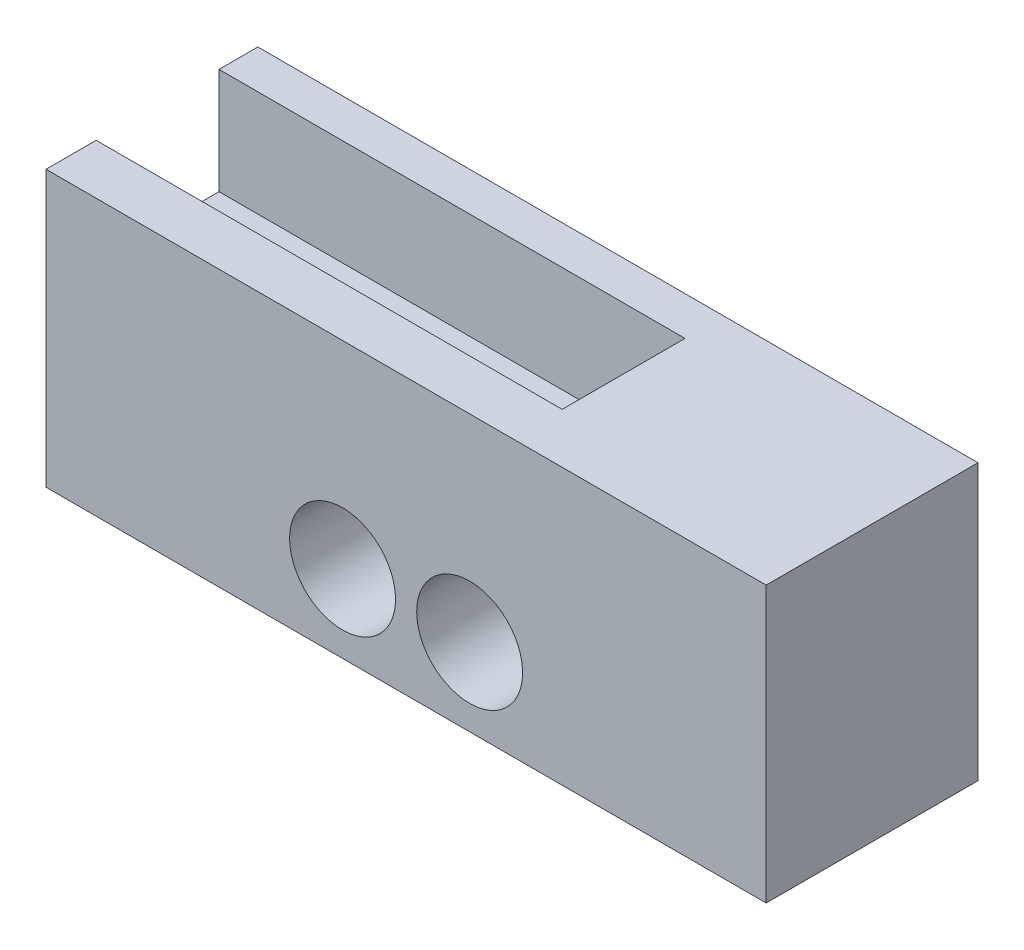
ISO-10303-21;
HEADER;
FILE_DESCRIPTION(('STEP AP214'),'2;1');
FILE_NAME('part.step','',(''),(''),'','','');
FILE_SCHEMA(('AUTOMOTIVE_DESIGN { 1 0 10303 214 1 1 1 1 }'));
ENDSEC;
DATA;
#1=APPLICATION_CONTEXT('core data for automotive mechanical design processes');
#2=APPLICATION_PROTOCOL_DEFINITION('international standard','automotive_design',2000,#1);
#3=PRODUCT_CONTEXT('',#1,'mechanical');
#4=PRODUCT('Part','Part','',(#3));
#5=PRODUCT_RELATED_PRODUCT_CATEGORY('part','',(#4));
#6=PRODUCT_DEFINITION_FORMATION('','',#4);
#7=PRODUCT_DEFINITION_CONTEXT('part definition',#1,'design');
#8=PRODUCT_DEFINITION('design','',#6,#7);
#9=PRODUCT_DEFINITION_SHAPE('','',#8);
#10=(LENGTH_UNIT() NAMED_UNIT(*) SI_UNIT(.MILLI.,.METRE.));
#11=(NAMED_UNIT(*) PLANE_ANGLE_UNIT() SI_UNIT($,.RADIAN.));
#12=(NAMED_UNIT(*) SI_UNIT($,.STERADIAN.) SOLID_ANGLE_UNIT());
#13=UNCERTAINTY_MEASURE_WITH_UNIT(LENGTH_MEASURE(1.E-05),#10,'distance_accuracy_value','');
#14=(GEOMETRIC_REPRESENTATION_CONTEXT(3) GLOBAL_UNCERTAINTY_ASSIGNED_CONTEXT((#13)) GLOBAL_UNIT_ASSIGNED_CONTEXT((#10,
#11,#12)) REPRESENTATION_CONTEXT('',''));
#15=CARTESIAN_POINT('',(0.,0.,0.));
#16=DIRECTION('',(0.,0.,1.));
#17=DIRECTION('',(1.,0.,0.));
#18=AXIS2_PLACEMENT_3D('',#15,#16,#17);
#19=CARTESIAN_POINT('',(-16.2916666666667,13.,-6.1625));
#20=DIRECTION('',(1.,0.,0.));
#21=DIRECTION('',(0.,0.,-1.));
#22=AXIS2_PLACEMENT_3D('',#19,#20,#21);
#23=PLANE('',#22);
#24=DIRECTION('',(0.,1.,0.));
#25=VECTOR('',#24,1.);
#26=CARTESIAN_POINT('',(-16.2916666666667,8.,-4.33087532120165));
#27=LINE('',#26,#25);
#28=CARTESIAN_POINT('',(-16.2916666666667,8.,-4.33087532120165));
#29=VERTEX_POINT('',#28);
#30=CARTESIAN_POINT('',(-16.2916666666667,13.,-4.33087532120165));
#31=VERTEX_POINT('',#30);
#32=EDGE_CURVE('E137',#29,#31,#27,.T.);
#33=ORIENTED_EDGE('',*,*,#32,.T.);
#34=DIRECTION('',(0.,0.,1.));
#35=VECTOR('',#34,1.);
#36=CARTESIAN_POINT('',(-16.2916666666667,13.,-6.1625));
#37=LINE('',#36,#35);
#38=CARTESIAN_POINT('',(-16.2916666666667,13.,-6.1625));
#39=VERTEX_POINT('',#38);
#40=EDGE_CURVE('E171',#39,#31,#37,.T.);
#41=ORIENTED_EDGE('',*,*,#40,.F.);
#42=DIRECTION('',(0.,-1.,0.));
#43=VECTOR('',#42,1.);
#44=CARTESIAN_POINT('',(-16.2916666666667,13.,-6.1625));
#45=LINE('',#44,#43);
#46=CARTESIAN_POINT('',(-16.2916666666667,0.,-6.1625));
#47=VERTEX_POINT('',#46);
#48=EDGE_CURVE('E178',#39,#47,#45,.T.);
#49=ORIENTED_EDGE('',*,*,#48,.T.);
#50=DIRECTION('',(0.,0.,1.));
#51=VECTOR('',#50,1.);
#52=CARTESIAN_POINT('',(-16.2916666666667,0.,-6.1625));
#53=LINE('',#52,#51);
#54=CARTESIAN_POINT('',(-16.2916666666667,0.,3.8375));
#55=VERTEX_POINT('',#54);
#56=EDGE_CURVE('E168',#47,#55,#53,.T.);
#57=ORIENTED_EDGE('',*,*,#56,.T.);
#58=DIRECTION('',(0.,-1.,0.));
#59=VECTOR('',#58,1.);
#60=CARTESIAN_POINT('',(-16.2916666666667,13.,3.8375));
#61=LINE('',#60,#59);
#62=CARTESIAN_POINT('',(-16.2916666666667,13.,3.8375));
#63=VERTEX_POINT('',#62);
#64=EDGE_CURVE('E12',#63,#55,#61,.T.);
#65=ORIENTED_EDGE('',*,*,#64,.F.);
#66=CARTESIAN_POINT('',(-16.2916666666667,13.,1.46912467879835));
#67=VERTEX_POINT('',#66);
#68=EDGE_CURVE('E107',#67,#63,#37,.T.);
#69=ORIENTED_EDGE('',*,*,#68,.F.);
#70=DIRECTION('',(0.,1.,0.));
#71=VECTOR('',#70,1.);
#72=CARTESIAN_POINT('',(-16.2916666666667,8.,1.46912467879835));
#73=LINE('',#72,#71);
#74=CARTESIAN_POINT('',(-16.2916666666667,8.,1.46912467879835));
#75=VERTEX_POINT('',#74);
#76=EDGE_CURVE('E71',#75,#67,#73,.T.);
#77=ORIENTED_EDGE('',*,*,#76,.F.);
#78=DIRECTION('',(0.,0.,1.));
#79=VECTOR('',#78,1.);
#80=CARTESIAN_POINT('',(-16.2916666666667,8.,0.));
#81=LINE('',#80,#79);
#82=EDGE_CURVE('E141',#29,#75,#81,.T.);
#83=ORIENTED_EDGE('',*,*,#82,.F.);
#84=EDGE_LOOP('',(#33,#41,#49,#57,#65,#69,#77,#83));
#85=FACE_BOUND('',#84,.T.);
#86=ADVANCED_FACE('F57',(#85),#23,.F.);
#87=CARTESIAN_POINT('',(0.,13.,0.));
#88=DIRECTION('',(0.,1.,0.));
#89=DIRECTION('',(0.,0.,1.));
#90=AXIS2_PLACEMENT_3D('',#87,#88,#89);
#91=PLANE('',#90);
#92=ORIENTED_EDGE('',*,*,#40,.T.);
#93=DIRECTION('',(1.,0.,0.));
#94=VECTOR('',#93,1.);
#95=CARTESIAN_POINT('',(0.,13.,-4.33087532120165));
#96=LINE('',#95,#94);
#97=CARTESIAN_POINT('',(5.70833333333334,13.,-4.33087532120165));
#98=VERTEX_POINT('',#97);
#99=EDGE_CURVE('E156',#31,#98,#96,.T.);
#100=ORIENTED_EDGE('',*,*,#99,.T.);
#101=DIRECTION('',(0.,0.,1.));
#102=VECTOR('',#101,1.);
#103=CARTESIAN_POINT('',(5.70833333333334,13.,0.));
#104=LINE('',#103,#102);
#105=CARTESIAN_POINT('',(5.70833333333334,13.,1.46912467879835));
#106=VERTEX_POINT('',#105);
#107=EDGE_CURVE('E148',#98,#106,#104,.T.);
#108=ORIENTED_EDGE('',*,*,#107,.T.);
#109=DIRECTION('',(1.,0.,0.));
#110=VECTOR('',#109,1.);
#111=CARTESIAN_POINT('',(0.,13.,1.46912467879835));
#112=LINE('',#111,#110);
#113=EDGE_CURVE('E154',#67,#106,#112,.T.);
#114=ORIENTED_EDGE('',*,*,#113,.F.);
#115=ORIENTED_EDGE('',*,*,#68,.T.);
#116=DIRECTION('',(1.,0.,0.));
#117=VECTOR('',#116,1.);
#118=CARTESIAN_POINT('',(-16.2916666666667,13.,3.8375));
#119=LINE('',#118,#117);
#120=CARTESIAN_POINT('',(17.7083333333333,13.,3.8375));
#121=VERTEX_POINT('',#120);
#122=EDGE_CURVE('E173',#63,#121,#119,.T.);
#123=ORIENTED_EDGE('',*,*,#122,.T.);
#124=DIRECTION('',(0.,0.,-1.));
#125=VECTOR('',#124,1.);
#126=CARTESIAN_POINT('',(17.7083333333333,13.,-6.1625));
#127=LINE('',#126,#125);
#128=CARTESIAN_POINT('',(17.7083333333333,13.,-6.1625));
#129=VERTEX_POINT('',#128);
#130=EDGE_CURVE('E175',#121,#129,#127,.T.);
#131=ORIENTED_EDGE('',*,*,#130,.T.);
#132=DIRECTION('',(-1.,0.,0.));
#133=VECTOR('',#132,1.);
#134=CARTESIAN_POINT('',(-16.2916666666667,13.,-6.1625));
#135=LINE('',#134,#133);
#136=EDGE_CURVE('E80',#129,#39,#135,.T.);
#137=ORIENTED_EDGE('',*,*,#136,.T.);
#138=EDGE_LOOP('',(#92,#100,#108,#114,#115,#123,#131,#137));
#139=FACE_BOUND('',#138,.T.);
#140=ADVANCED_FACE('F216',(#139),#91,.T.);
#141=CARTESIAN_POINT('',(-16.2916666666667,13.,3.8375));
#142=DIRECTION('',(0.,0.,-1.));
#143=DIRECTION('',(-1.,0.,0.));
#144=AXIS2_PLACEMENT_3D('',#141,#142,#143);
#145=PLANE('',#144);
#146=CARTESIAN_POINT('',(-2.29166666666666,3.66319413262773,3.8375));
#147=DIRECTION('',(0.,0.,-1.));
#148=DIRECTION('',(-1.,0.,0.));
#149=AXIS2_PLACEMENT_3D('',#146,#147,#148);
#150=CIRCLE('',#149,2.5);
#151=CARTESIAN_POINT('',(-4.79166666666666,3.66319413262773,3.8375));
#152=VERTEX_POINT('',#151);
#153=EDGE_CURVE('E159',#152,#152,#150,.T.);
#154=ORIENTED_EDGE('',*,*,#153,.T.);
#155=EDGE_LOOP('',(#154));
#156=FACE_BOUND('',#155,.T.);
#157=CARTESIAN_POINT('',(3.70833333333334,3.66319413262773,3.8375));
#158=DIRECTION('',(0.,0.,-1.));
#159=DIRECTION('',(-1.,0.,0.));
#160=AXIS2_PLACEMENT_3D('',#157,#158,#159);
#161=CIRCLE('',#160,2.5);
#162=CARTESIAN_POINT('',(1.20833333333334,3.66319413262773,3.8375));
#163=VERTEX_POINT('',#162);
#164=EDGE_CURVE('E249',#163,#163,#161,.T.);
#165=ORIENTED_EDGE('',*,*,#164,.T.);
#166=EDGE_LOOP('',(#165));
#167=FACE_BOUND('',#166,.T.);
#168=DIRECTION('',(1.,0.,0.));
#169=VECTOR('',#168,1.);
#170=CARTESIAN_POINT('',(-16.2916666666667,0.,3.8375));
#171=LINE('',#170,#169);
#172=CARTESIAN_POINT('',(17.7083333333333,0.,3.8375));
#173=VERTEX_POINT('',#172);
#174=EDGE_CURVE('E181',#55,#173,#171,.T.);
#175=ORIENTED_EDGE('',*,*,#174,.T.);
#176=DIRECTION('',(0.,-1.,0.));
#177=VECTOR('',#176,1.);
#178=CARTESIAN_POINT('',(17.7083333333333,13.,3.8375));
#179=LINE('',#178,#177);
#180=EDGE_CURVE('E64',#121,#173,#179,.T.);
#181=ORIENTED_EDGE('',*,*,#180,.F.);
#182=ORIENTED_EDGE('',*,*,#122,.F.);
#183=ORIENTED_EDGE('',*,*,#64,.T.);
#184=EDGE_LOOP('',(#175,#181,#182,#183));
#185=FACE_BOUND('',#184,.T.);
#186=ADVANCED_FACE('F211',(#156,#167,#185),#145,.F.);
#187=CARTESIAN_POINT('',(17.7083333333333,13.,-6.1625));
#188=DIRECTION('',(-1.,0.,0.));
#189=DIRECTION('',(0.,0.,1.));
#190=AXIS2_PLACEMENT_3D('',#187,#188,#189);
#191=PLANE('',#190);
#192=DIRECTION('',(0.,0.,-1.));
#193=VECTOR('',#192,1.);
#194=CARTESIAN_POINT('',(17.7083333333333,0.,-6.1625));
#195=LINE('',#194,#193);
#196=CARTESIAN_POINT('',(17.7083333333333,0.,-6.1625));
#197=VERTEX_POINT('',#196);
#198=EDGE_CURVE('E183',#173,#197,#195,.T.);
#199=ORIENTED_EDGE('',*,*,#198,.T.);
#200=DIRECTION('',(0.,-1.,0.));
#201=VECTOR('',#200,1.);
#202=CARTESIAN_POINT('',(17.7083333333333,13.,-6.1625));
#203=LINE('',#202,#201);
#204=EDGE_CURVE('E187',#129,#197,#203,.T.);
#205=ORIENTED_EDGE('',*,*,#204,.F.);
#206=ORIENTED_EDGE('',*,*,#130,.F.);
#207=ORIENTED_EDGE('',*,*,#180,.T.);
#208=EDGE_LOOP('',(#199,#205,#206,#207));
#209=FACE_BOUND('',#208,.T.);
#210=ADVANCED_FACE('F193',(#209),#191,.F.);
#211=CARTESIAN_POINT('',(-16.2916666666667,13.,-6.1625));
#212=DIRECTION('',(0.,0.,1.));
#213=DIRECTION('',(1.,0.,0.));
#214=AXIS2_PLACEMENT_3D('',#211,#212,#213);
#215=PLANE('',#214);
#216=CARTESIAN_POINT('',(-2.29166666666666,3.66319413262773,-6.1625));
#217=DIRECTION('',(0.,0.,-1.));
#218=DIRECTION('',(-1.,0.,0.));
#219=AXIS2_PLACEMENT_3D('',#216,#217,#218);
#220=CIRCLE('',#219,2.5);
#221=CARTESIAN_POINT('',(-4.79166666666666,3.66319413262773,-6.1625));
#222=VERTEX_POINT('',#221);
#223=EDGE_CURVE('E246',#222,#222,#220,.T.);
#224=ORIENTED_EDGE('',*,*,#223,.F.);
#225=EDGE_LOOP('',(#224));
#226=FACE_BOUND('',#225,.T.);
#227=CARTESIAN_POINT('',(3.70833333333334,3.66319413262773,-6.1625));
#228=DIRECTION('',(0.,0.,-1.));
#229=DIRECTION('',(-1.,0.,0.));
#230=AXIS2_PLACEMENT_3D('',#227,#228,#229);
#231=CIRCLE('',#230,2.5);
#232=CARTESIAN_POINT('',(1.20833333333334,3.66319413262773,-6.1625));
#233=VERTEX_POINT('',#232);
#234=EDGE_CURVE('E253',#233,#233,#231,.T.);
#235=ORIENTED_EDGE('',*,*,#234,.F.);
#236=EDGE_LOOP('',(#235));
#237=FACE_BOUND('',#236,.T.);
#238=DIRECTION('',(-1.,0.,0.));
#239=VECTOR('',#238,1.);
#240=CARTESIAN_POINT('',(-16.2916666666667,0.,-6.1625));
#241=LINE('',#240,#239);
#242=EDGE_CURVE('E101',#197,#47,#241,.T.);
#243=ORIENTED_EDGE('',*,*,#242,.T.);
#244=ORIENTED_EDGE('',*,*,#48,.F.);
#245=ORIENTED_EDGE('',*,*,#136,.F.);
#246=ORIENTED_EDGE('',*,*,#204,.T.);
#247=EDGE_LOOP('',(#243,#244,#245,#246));
#248=FACE_BOUND('',#247,.T.);
#249=ADVANCED_FACE('F202',(#226,#237,#248),#215,.F.);
#250=CARTESIAN_POINT('',(0.,0.,0.));
#251=DIRECTION('',(0.,1.,0.));
#252=DIRECTION('',(0.,0.,1.));
#253=AXIS2_PLACEMENT_3D('',#250,#251,#252);
#254=PLANE('',#253);
#255=ORIENTED_EDGE('',*,*,#56,.F.);
#256=ORIENTED_EDGE('',*,*,#242,.F.);
#257=ORIENTED_EDGE('',*,*,#198,.F.);
#258=ORIENTED_EDGE('',*,*,#174,.F.);
#259=EDGE_LOOP('',(#255,#256,#257,#258));
#260=FACE_BOUND('',#259,.T.);
#261=ADVANCED_FACE('F198',(#260),#254,.F.);
#262=CARTESIAN_POINT('',(5.70833333333334,8.,0.));
#263=DIRECTION('',(-1.,0.,0.));
#264=DIRECTION('',(0.,0.,1.));
#265=AXIS2_PLACEMENT_3D('',#262,#263,#264);
#266=PLANE('',#265);
#267=ORIENTED_EDGE('',*,*,#107,.F.);
#268=DIRECTION('',(0.,1.,0.));
#269=VECTOR('',#268,1.);
#270=CARTESIAN_POINT('',(5.70833333333334,8.,-4.33087532120165));
#271=LINE('',#270,#269);
#272=CARTESIAN_POINT('',(5.70833333333334,8.,-4.33087532120165));
#273=VERTEX_POINT('',#272);
#274=EDGE_CURVE('E134',#273,#98,#271,.T.);
#275=ORIENTED_EDGE('',*,*,#274,.F.);
#276=DIRECTION('',(0.,0.,1.));
#277=VECTOR('',#276,1.);
#278=CARTESIAN_POINT('',(5.70833333333334,8.,0.));
#279=LINE('',#278,#277);
#280=CARTESIAN_POINT('',(5.70833333333334,8.,1.46912467879835));
#281=VERTEX_POINT('',#280);
#282=EDGE_CURVE('E142',#273,#281,#279,.T.);
#283=ORIENTED_EDGE('',*,*,#282,.T.);
#284=DIRECTION('',(0.,1.,0.));
#285=VECTOR('',#284,1.);
#286=CARTESIAN_POINT('',(5.70833333333334,8.,1.46912467879835));
#287=LINE('',#286,#285);
#288=EDGE_CURVE('E166',#281,#106,#287,.T.);
#289=ORIENTED_EDGE('',*,*,#288,.T.);
#290=EDGE_LOOP('',(#267,#275,#283,#289));
#291=FACE_BOUND('',#290,.T.);
#292=ADVANCED_FACE('F145',(#291),#266,.T.);
#293=CARTESIAN_POINT('',(0.,8.,-4.33087532120165));
#294=DIRECTION('',(0.,0.,1.));
#295=DIRECTION('',(1.,0.,0.));
#296=AXIS2_PLACEMENT_3D('',#293,#294,#295);
#297=PLANE('',#296);
#298=ORIENTED_EDGE('',*,*,#99,.F.);
#299=ORIENTED_EDGE('',*,*,#32,.F.);
#300=DIRECTION('',(1.,0.,0.));
#301=VECTOR('',#300,1.);
#302=CARTESIAN_POINT('',(0.,8.,-4.33087532120165));
#303=LINE('',#302,#301);
#304=EDGE_CURVE('E131',#29,#273,#303,.T.);
#305=ORIENTED_EDGE('',*,*,#304,.T.);
#306=ORIENTED_EDGE('',*,*,#274,.T.);
#307=EDGE_LOOP('',(#298,#299,#305,#306));
#308=FACE_BOUND('',#307,.T.);
#309=ADVANCED_FACE('F133',(#308),#297,.T.);
#310=CARTESIAN_POINT('',(0.,8.,1.46912467879835));
#311=DIRECTION('',(0.,0.,1.));
#312=DIRECTION('',(1.,0.,0.));
#313=AXIS2_PLACEMENT_3D('',#310,#311,#312);
#314=PLANE('',#313);
#315=ORIENTED_EDGE('',*,*,#113,.T.);
#316=ORIENTED_EDGE('',*,*,#288,.F.);
#317=DIRECTION('',(1.,0.,0.));
#318=VECTOR('',#317,1.);
#319=CARTESIAN_POINT('',(0.,8.,1.46912467879835));
#320=LINE('',#319,#318);
#321=EDGE_CURVE('E150',#75,#281,#320,.T.);
#322=ORIENTED_EDGE('',*,*,#321,.F.);
#323=ORIENTED_EDGE('',*,*,#76,.T.);
#324=EDGE_LOOP('',(#315,#316,#322,#323));
#325=FACE_BOUND('',#324,.T.);
#326=ADVANCED_FACE('F230',(#325),#314,.F.);
#327=CARTESIAN_POINT('',(0.,8.,0.));
#328=DIRECTION('',(0.,1.,0.));
#329=DIRECTION('',(0.,0.,1.));
#330=AXIS2_PLACEMENT_3D('',#327,#328,#329);
#331=PLANE('',#330);
#332=ORIENTED_EDGE('',*,*,#282,.F.);
#333=ORIENTED_EDGE('',*,*,#304,.F.);
#334=ORIENTED_EDGE('',*,*,#82,.T.);
#335=ORIENTED_EDGE('',*,*,#321,.T.);
#336=EDGE_LOOP('',(#332,#333,#334,#335));
#337=FACE_BOUND('',#336,.T.);
#338=ADVANCED_FACE('F153',(#337),#331,.T.);
#339=CARTESIAN_POINT('',(3.70833333333334,3.66319413262773,13.8375));
#340=DIRECTION('',(0.,0.,-1.));
#341=DIRECTION('',(-1.,0.,0.));
#342=AXIS2_PLACEMENT_3D('',#339,#340,#341);
#343=CYLINDRICAL_SURFACE('',#342,2.5);
#344=ORIENTED_EDGE('',*,*,#234,.T.);
#345=EDGE_LOOP('',(#344));
#346=FACE_BOUND('',#345,.T.);
#347=ORIENTED_EDGE('',*,*,#164,.F.);
#348=EDGE_LOOP('',(#347));
#349=FACE_BOUND('',#348,.T.);
#350=ADVANCED_FACE('F235',(#346,#349),#343,.F.);
#351=CARTESIAN_POINT('',(-2.29166666666666,3.66319413262773,13.8375));
#352=DIRECTION('',(0.,0.,-1.));
#353=DIRECTION('',(-1.,0.,0.));
#354=AXIS2_PLACEMENT_3D('',#351,#352,#353);
#355=CYLINDRICAL_SURFACE('',#354,2.5);
#356=ORIENTED_EDGE('',*,*,#223,.T.);
#357=EDGE_LOOP('',(#356));
#358=FACE_BOUND('',#357,.T.);
#359=ORIENTED_EDGE('',*,*,#153,.F.);
#360=EDGE_LOOP('',(#359));
#361=FACE_BOUND('',#360,.T.);
#362=ADVANCED_FACE('F238',(#358,#361),#355,.F.);
#363=CLOSED_SHELL('',(#86,#140,#186,#210,#249,#261,#292,#309,#326,#338,#350,#362));
#364=MANIFOLD_SOLID_BREP('B2',#363);
#365=ADVANCED_BREP_SHAPE_REPRESENTATION('',(#18,#364),#14);
#366=SHAPE_DEFINITION_REPRESENTATION(#9,#365);
ENDSEC;
END-ISO-10303-21;
